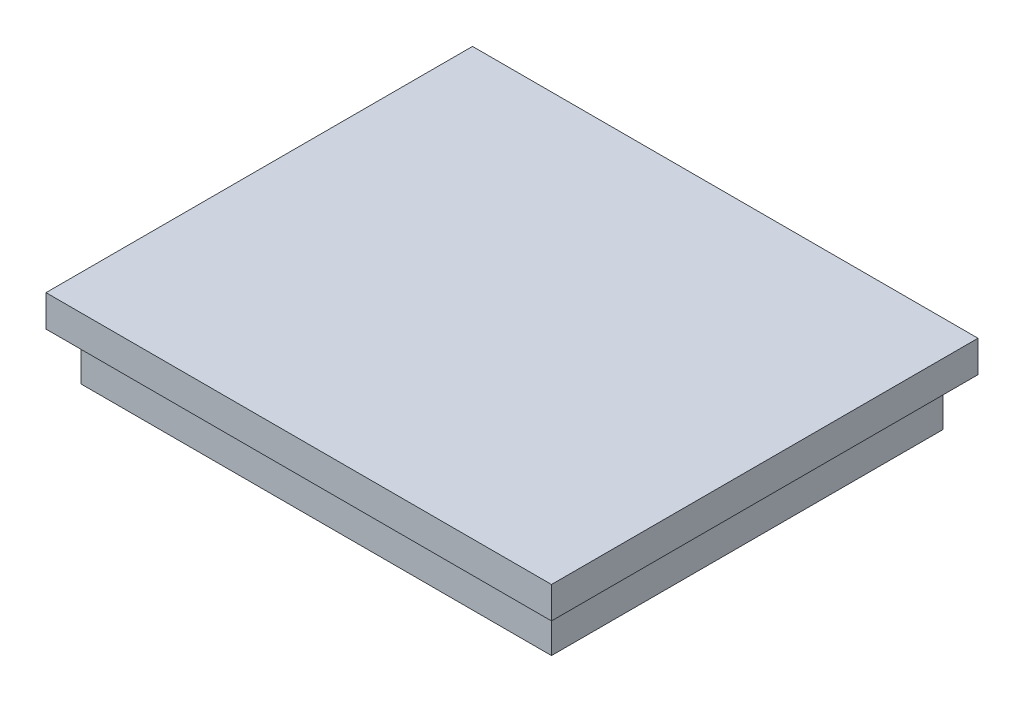
ISO-10303-21;
HEADER;
FILE_DESCRIPTION(('STEP AP214'),'2;1');
FILE_NAME('part.step','',(''),(''),'','','');
FILE_SCHEMA(('AUTOMOTIVE_DESIGN { 1 0 10303 214 1 1 1 1 }'));
ENDSEC;
DATA;
#1=APPLICATION_CONTEXT('core data for automotive mechanical design processes');
#2=APPLICATION_PROTOCOL_DEFINITION('international standard','automotive_design',2000,#1);
#3=PRODUCT_CONTEXT('',#1,'mechanical');
#4=PRODUCT('Part','Part','',(#3));
#5=PRODUCT_RELATED_PRODUCT_CATEGORY('part','',(#4));
#6=PRODUCT_DEFINITION_FORMATION('','',#4);
#7=PRODUCT_DEFINITION_CONTEXT('part definition',#1,'design');
#8=PRODUCT_DEFINITION('design','',#6,#7);
#9=PRODUCT_DEFINITION_SHAPE('','',#8);
#10=(LENGTH_UNIT() NAMED_UNIT(*) SI_UNIT(.MILLI.,.METRE.));
#11=(NAMED_UNIT(*) PLANE_ANGLE_UNIT() SI_UNIT($,.RADIAN.));
#12=(NAMED_UNIT(*) SI_UNIT($,.STERADIAN.) SOLID_ANGLE_UNIT());
#13=UNCERTAINTY_MEASURE_WITH_UNIT(LENGTH_MEASURE(1.E-05),#10,'distance_accuracy_value','');
#14=(GEOMETRIC_REPRESENTATION_CONTEXT(3) GLOBAL_UNCERTAINTY_ASSIGNED_CONTEXT((#13)) GLOBAL_UNIT_ASSIGNED_CONTEXT((#10,
#11,#12)) REPRESENTATION_CONTEXT('',''));
#15=CARTESIAN_POINT('',(0.,0.,0.));
#16=DIRECTION('',(0.,0.,1.));
#17=DIRECTION('',(1.,0.,0.));
#18=AXIS2_PLACEMENT_3D('',#15,#16,#17);
#19=CARTESIAN_POINT('',(-14.9,3.,12.4));
#20=DIRECTION('',(1.,0.,0.));
#21=DIRECTION('',(0.,0.,-1.));
#22=AXIS2_PLACEMENT_3D('',#19,#20,#21);
#23=PLANE('',#22);
#24=DIRECTION('',(0.,0.,1.));
#25=VECTOR('',#24,1.);
#26=CARTESIAN_POINT('',(-14.9,0.,12.4));
#27=LINE('',#26,#25);
#28=CARTESIAN_POINT('',(-14.9,0.,-12.4));
#29=VERTEX_POINT('',#28);
#30=CARTESIAN_POINT('',(-14.9,0.,12.4));
#31=VERTEX_POINT('',#30);
#32=EDGE_CURVE('E132',#29,#31,#27,.T.);
#33=ORIENTED_EDGE('',*,*,#32,.T.);
#34=DIRECTION('',(0.,-1.,0.));
#35=VECTOR('',#34,1.);
#36=CARTESIAN_POINT('',(-14.9,3.,12.4));
#37=LINE('',#36,#35);
#38=CARTESIAN_POINT('',(-14.9,3.,12.4));
#39=VERTEX_POINT('',#38);
#40=EDGE_CURVE('E11',#39,#31,#37,.T.);
#41=ORIENTED_EDGE('',*,*,#40,.F.);
#42=DIRECTION('',(0.,0.,1.));
#43=VECTOR('',#42,1.);
#44=CARTESIAN_POINT('',(-14.9,3.,12.4));
#45=LINE('',#44,#43);
#46=CARTESIAN_POINT('',(-14.9,3.,-12.4));
#47=VERTEX_POINT('',#46);
#48=EDGE_CURVE('E141',#47,#39,#45,.T.);
#49=ORIENTED_EDGE('',*,*,#48,.F.);
#50=DIRECTION('',(0.,-1.,0.));
#51=VECTOR('',#50,1.);
#52=CARTESIAN_POINT('',(-14.9,3.,-12.4));
#53=LINE('',#52,#51);
#54=EDGE_CURVE('E150',#47,#29,#53,.T.);
#55=ORIENTED_EDGE('',*,*,#54,.T.);
#56=EDGE_LOOP('',(#33,#41,#49,#55));
#57=FACE_BOUND('',#56,.T.);
#58=ADVANCED_FACE('F34',(#57),#23,.F.);
#59=CARTESIAN_POINT('',(14.9,3.,12.4));
#60=DIRECTION('',(0.,0.,-1.));
#61=DIRECTION('',(-1.,0.,0.));
#62=AXIS2_PLACEMENT_3D('',#59,#60,#61);
#63=PLANE('',#62);
#64=DIRECTION('',(1.,0.,0.));
#65=VECTOR('',#64,1.);
#66=CARTESIAN_POINT('',(14.9,0.,12.4));
#67=LINE('',#66,#65);
#68=CARTESIAN_POINT('',(14.9,0.,12.4));
#69=VERTEX_POINT('',#68);
#70=EDGE_CURVE('E135',#31,#69,#67,.T.);
#71=ORIENTED_EDGE('',*,*,#70,.T.);
#72=DIRECTION('',(0.,-1.,0.));
#73=VECTOR('',#72,1.);
#74=CARTESIAN_POINT('',(14.9,3.,12.4));
#75=LINE('',#74,#73);
#76=CARTESIAN_POINT('',(14.9,3.,12.4));
#77=VERTEX_POINT('',#76);
#78=EDGE_CURVE('E42',#77,#69,#75,.T.);
#79=ORIENTED_EDGE('',*,*,#78,.F.);
#80=DIRECTION('',(1.,0.,0.));
#81=VECTOR('',#80,1.);
#82=CARTESIAN_POINT('',(14.9,3.,12.4));
#83=LINE('',#82,#81);
#84=EDGE_CURVE('E76',#39,#77,#83,.T.);
#85=ORIENTED_EDGE('',*,*,#84,.F.);
#86=ORIENTED_EDGE('',*,*,#40,.T.);
#87=EDGE_LOOP('',(#71,#79,#85,#86));
#88=FACE_BOUND('',#87,.T.);
#89=ADVANCED_FACE('F176',(#88),#63,.F.);
#90=CARTESIAN_POINT('',(14.9,3.,12.4));
#91=DIRECTION('',(-1.,0.,0.));
#92=DIRECTION('',(0.,0.,1.));
#93=AXIS2_PLACEMENT_3D('',#90,#91,#92);
#94=PLANE('',#93);
#95=DIRECTION('',(0.,0.,-1.));
#96=VECTOR('',#95,1.);
#97=CARTESIAN_POINT('',(14.9,0.,12.4));
#98=LINE('',#97,#96);
#99=CARTESIAN_POINT('',(14.9,0.,-12.4));
#100=VERTEX_POINT('',#99);
#101=EDGE_CURVE('E66',#69,#100,#98,.T.);
#102=ORIENTED_EDGE('',*,*,#101,.T.);
#103=DIRECTION('',(0.,-1.,0.));
#104=VECTOR('',#103,1.);
#105=CARTESIAN_POINT('',(14.9,3.,-12.4));
#106=LINE('',#105,#104);
#107=CARTESIAN_POINT('',(14.9,3.,-12.4));
#108=VERTEX_POINT('',#107);
#109=EDGE_CURVE('E50',#108,#100,#106,.T.);
#110=ORIENTED_EDGE('',*,*,#109,.F.);
#111=DIRECTION('',(0.,0.,-1.));
#112=VECTOR('',#111,1.);
#113=CARTESIAN_POINT('',(14.9,3.,12.4));
#114=LINE('',#113,#112);
#115=EDGE_CURVE('E145',#77,#108,#114,.T.);
#116=ORIENTED_EDGE('',*,*,#115,.F.);
#117=ORIENTED_EDGE('',*,*,#78,.T.);
#118=EDGE_LOOP('',(#102,#110,#116,#117));
#119=FACE_BOUND('',#118,.T.);
#120=ADVANCED_FACE('F156',(#119),#94,.F.);
#121=CARTESIAN_POINT('',(14.9,3.,-12.4));
#122=DIRECTION('',(0.,0.,1.));
#123=DIRECTION('',(1.,0.,0.));
#124=AXIS2_PLACEMENT_3D('',#121,#122,#123);
#125=PLANE('',#124);
#126=DIRECTION('',(-1.,0.,0.));
#127=VECTOR('',#126,1.);
#128=CARTESIAN_POINT('',(14.9,0.,-12.4));
#129=LINE('',#128,#127);
#130=EDGE_CURVE('E71',#100,#29,#129,.T.);
#131=ORIENTED_EDGE('',*,*,#130,.T.);
#132=ORIENTED_EDGE('',*,*,#54,.F.);
#133=DIRECTION('',(-1.,0.,0.));
#134=VECTOR('',#133,1.);
#135=CARTESIAN_POINT('',(14.9,3.,-12.4));
#136=LINE('',#135,#134);
#137=EDGE_CURVE('E148',#108,#47,#136,.T.);
#138=ORIENTED_EDGE('',*,*,#137,.F.);
#139=ORIENTED_EDGE('',*,*,#109,.T.);
#140=EDGE_LOOP('',(#131,#132,#138,#139));
#141=FACE_BOUND('',#140,.T.);
#142=ADVANCED_FACE('F161',(#141),#125,.F.);
#143=CARTESIAN_POINT('',(0.,0.,0.));
#144=DIRECTION('',(0.,1.,0.));
#145=DIRECTION('',(0.,0.,1.));
#146=AXIS2_PLACEMENT_3D('',#143,#144,#145);
#147=PLANE('',#146);
#148=ORIENTED_EDGE('',*,*,#32,.F.);
#149=ORIENTED_EDGE('',*,*,#130,.F.);
#150=ORIENTED_EDGE('',*,*,#101,.F.);
#151=ORIENTED_EDGE('',*,*,#70,.F.);
#152=EDGE_LOOP('',(#148,#149,#150,#151));
#153=FACE_BOUND('',#152,.T.);
#154=ADVANCED_FACE('F159',(#153),#147,.F.);
#155=CARTESIAN_POINT('',(0.,3.,0.));
#156=DIRECTION('',(0.,1.,0.));
#157=DIRECTION('',(0.,0.,1.));
#158=AXIS2_PLACEMENT_3D('',#155,#156,#157);
#159=PLANE('',#158);
#160=DIRECTION('',(0.,0.,1.));
#161=VECTOR('',#160,1.);
#162=CARTESIAN_POINT('',(-16.,3.,13.5));
#163=LINE('',#162,#161);
#164=CARTESIAN_POINT('',(-16.,3.,-13.5));
#165=VERTEX_POINT('',#164);
#166=CARTESIAN_POINT('',(-16.,3.,13.5));
#167=VERTEX_POINT('',#166);
#168=EDGE_CURVE('E131',#165,#167,#163,.T.);
#169=ORIENTED_EDGE('',*,*,#168,.F.);
#170=DIRECTION('',(-1.,0.,0.));
#171=VECTOR('',#170,1.);
#172=CARTESIAN_POINT('',(16.,3.,-13.5));
#173=LINE('',#172,#171);
#174=CARTESIAN_POINT('',(16.,3.,-13.5));
#175=VERTEX_POINT('',#174);
#176=EDGE_CURVE('E127',#175,#165,#173,.T.);
#177=ORIENTED_EDGE('',*,*,#176,.F.);
#178=DIRECTION('',(0.,0.,-1.));
#179=VECTOR('',#178,1.);
#180=CARTESIAN_POINT('',(16.,3.,13.5));
#181=LINE('',#180,#179);
#182=CARTESIAN_POINT('',(16.,3.,13.5));
#183=VERTEX_POINT('',#182);
#184=EDGE_CURVE('E203',#183,#175,#181,.T.);
#185=ORIENTED_EDGE('',*,*,#184,.F.);
#186=DIRECTION('',(1.,0.,0.));
#187=VECTOR('',#186,1.);
#188=CARTESIAN_POINT('',(16.,3.,13.5));
#189=LINE('',#188,#187);
#190=EDGE_CURVE('E206',#167,#183,#189,.T.);
#191=ORIENTED_EDGE('',*,*,#190,.F.);
#192=EDGE_LOOP('',(#169,#177,#185,#191));
#193=FACE_BOUND('',#192,.T.);
#194=ORIENTED_EDGE('',*,*,#137,.T.);
#195=ORIENTED_EDGE('',*,*,#48,.T.);
#196=ORIENTED_EDGE('',*,*,#84,.T.);
#197=ORIENTED_EDGE('',*,*,#115,.T.);
#198=EDGE_LOOP('',(#194,#195,#196,#197));
#199=FACE_BOUND('',#198,.T.);
#200=ADVANCED_FACE('F163',(#193,#199),#159,.F.);
#201=CARTESIAN_POINT('',(-16.,5.,13.5));
#202=DIRECTION('',(1.,0.,0.));
#203=DIRECTION('',(0.,0.,-1.));
#204=AXIS2_PLACEMENT_3D('',#201,#202,#203);
#205=PLANE('',#204);
#206=ORIENTED_EDGE('',*,*,#168,.T.);
#207=DIRECTION('',(0.,-1.,0.));
#208=VECTOR('',#207,1.);
#209=CARTESIAN_POINT('',(-16.,5.,13.5));
#210=LINE('',#209,#208);
#211=CARTESIAN_POINT('',(-16.,5.,13.5));
#212=VERTEX_POINT('',#211);
#213=EDGE_CURVE('E111',#212,#167,#210,.T.);
#214=ORIENTED_EDGE('',*,*,#213,.F.);
#215=DIRECTION('',(0.,0.,1.));
#216=VECTOR('',#215,1.);
#217=CARTESIAN_POINT('',(-16.,5.,13.5));
#218=LINE('',#217,#216);
#219=CARTESIAN_POINT('',(-16.,5.,-13.5));
#220=VERTEX_POINT('',#219);
#221=EDGE_CURVE('E118',#220,#212,#218,.T.);
#222=ORIENTED_EDGE('',*,*,#221,.F.);
#223=DIRECTION('',(0.,-1.,0.));
#224=VECTOR('',#223,1.);
#225=CARTESIAN_POINT('',(-16.,5.,-13.5));
#226=LINE('',#225,#224);
#227=EDGE_CURVE('E200',#220,#165,#226,.T.);
#228=ORIENTED_EDGE('',*,*,#227,.T.);
#229=EDGE_LOOP('',(#206,#214,#222,#228));
#230=FACE_BOUND('',#229,.T.);
#231=ADVANCED_FACE('F129',(#230),#205,.F.);
#232=CARTESIAN_POINT('',(16.,5.,13.5));
#233=DIRECTION('',(0.,0.,-1.));
#234=DIRECTION('',(-1.,0.,0.));
#235=AXIS2_PLACEMENT_3D('',#232,#233,#234);
#236=PLANE('',#235);
#237=ORIENTED_EDGE('',*,*,#190,.T.);
#238=DIRECTION('',(0.,-1.,0.));
#239=VECTOR('',#238,1.);
#240=CARTESIAN_POINT('',(16.,5.,13.5));
#241=LINE('',#240,#239);
#242=CARTESIAN_POINT('',(16.,5.,13.5));
#243=VERTEX_POINT('',#242);
#244=EDGE_CURVE('E114',#243,#183,#241,.T.);
#245=ORIENTED_EDGE('',*,*,#244,.F.);
#246=DIRECTION('',(1.,0.,0.));
#247=VECTOR('',#246,1.);
#248=CARTESIAN_POINT('',(16.,5.,13.5));
#249=LINE('',#248,#247);
#250=EDGE_CURVE('E107',#212,#243,#249,.T.);
#251=ORIENTED_EDGE('',*,*,#250,.F.);
#252=ORIENTED_EDGE('',*,*,#213,.T.);
#253=EDGE_LOOP('',(#237,#245,#251,#252));
#254=FACE_BOUND('',#253,.T.);
#255=ADVANCED_FACE('F109',(#254),#236,.F.);
#256=CARTESIAN_POINT('',(16.,5.,13.5));
#257=DIRECTION('',(-1.,0.,0.));
#258=DIRECTION('',(0.,0.,1.));
#259=AXIS2_PLACEMENT_3D('',#256,#257,#258);
#260=PLANE('',#259);
#261=ORIENTED_EDGE('',*,*,#184,.T.);
#262=DIRECTION('',(0.,-1.,0.));
#263=VECTOR('',#262,1.);
#264=CARTESIAN_POINT('',(16.,5.,-13.5));
#265=LINE('',#264,#263);
#266=CARTESIAN_POINT('',(16.,5.,-13.5));
#267=VERTEX_POINT('',#266);
#268=EDGE_CURVE('E137',#267,#175,#265,.T.);
#269=ORIENTED_EDGE('',*,*,#268,.F.);
#270=DIRECTION('',(0.,0.,-1.));
#271=VECTOR('',#270,1.);
#272=CARTESIAN_POINT('',(16.,5.,13.5));
#273=LINE('',#272,#271);
#274=EDGE_CURVE('E117',#243,#267,#273,.T.);
#275=ORIENTED_EDGE('',*,*,#274,.F.);
#276=ORIENTED_EDGE('',*,*,#244,.T.);
#277=EDGE_LOOP('',(#261,#269,#275,#276));
#278=FACE_BOUND('',#277,.T.);
#279=ADVANCED_FACE('F189',(#278),#260,.F.);
#280=CARTESIAN_POINT('',(16.,5.,-13.5));
#281=DIRECTION('',(0.,0.,1.));
#282=DIRECTION('',(1.,0.,0.));
#283=AXIS2_PLACEMENT_3D('',#280,#281,#282);
#284=PLANE('',#283);
#285=ORIENTED_EDGE('',*,*,#176,.T.);
#286=ORIENTED_EDGE('',*,*,#227,.F.);
#287=DIRECTION('',(-1.,0.,0.));
#288=VECTOR('',#287,1.);
#289=CARTESIAN_POINT('',(16.,5.,-13.5));
#290=LINE('',#289,#288);
#291=EDGE_CURVE('E123',#267,#220,#290,.T.);
#292=ORIENTED_EDGE('',*,*,#291,.F.);
#293=ORIENTED_EDGE('',*,*,#268,.T.);
#294=EDGE_LOOP('',(#285,#286,#292,#293));
#295=FACE_BOUND('',#294,.T.);
#296=ADVANCED_FACE('F191',(#295),#284,.F.);
#297=CARTESIAN_POINT('',(0.,5.,0.));
#298=DIRECTION('',(0.,1.,0.));
#299=DIRECTION('',(0.,0.,1.));
#300=AXIS2_PLACEMENT_3D('',#297,#298,#299);
#301=PLANE('',#300);
#302=ORIENTED_EDGE('',*,*,#221,.T.);
#303=ORIENTED_EDGE('',*,*,#250,.T.);
#304=ORIENTED_EDGE('',*,*,#274,.T.);
#305=ORIENTED_EDGE('',*,*,#291,.T.);
#306=EDGE_LOOP('',(#302,#303,#304,#305));
#307=FACE_BOUND('',#306,.T.);
#308=ADVANCED_FACE('F121',(#307),#301,.T.);
#309=CLOSED_SHELL('',(#58,#89,#120,#142,#154,#200,#231,#255,#279,#296,#308));
#310=MANIFOLD_SOLID_BREP('B2',#309);
#311=ADVANCED_BREP_SHAPE_REPRESENTATION('',(#18,#310),#14);
#312=SHAPE_DEFINITION_REPRESENTATION(#9,#311);
ENDSEC;
END-ISO-10303-21;
